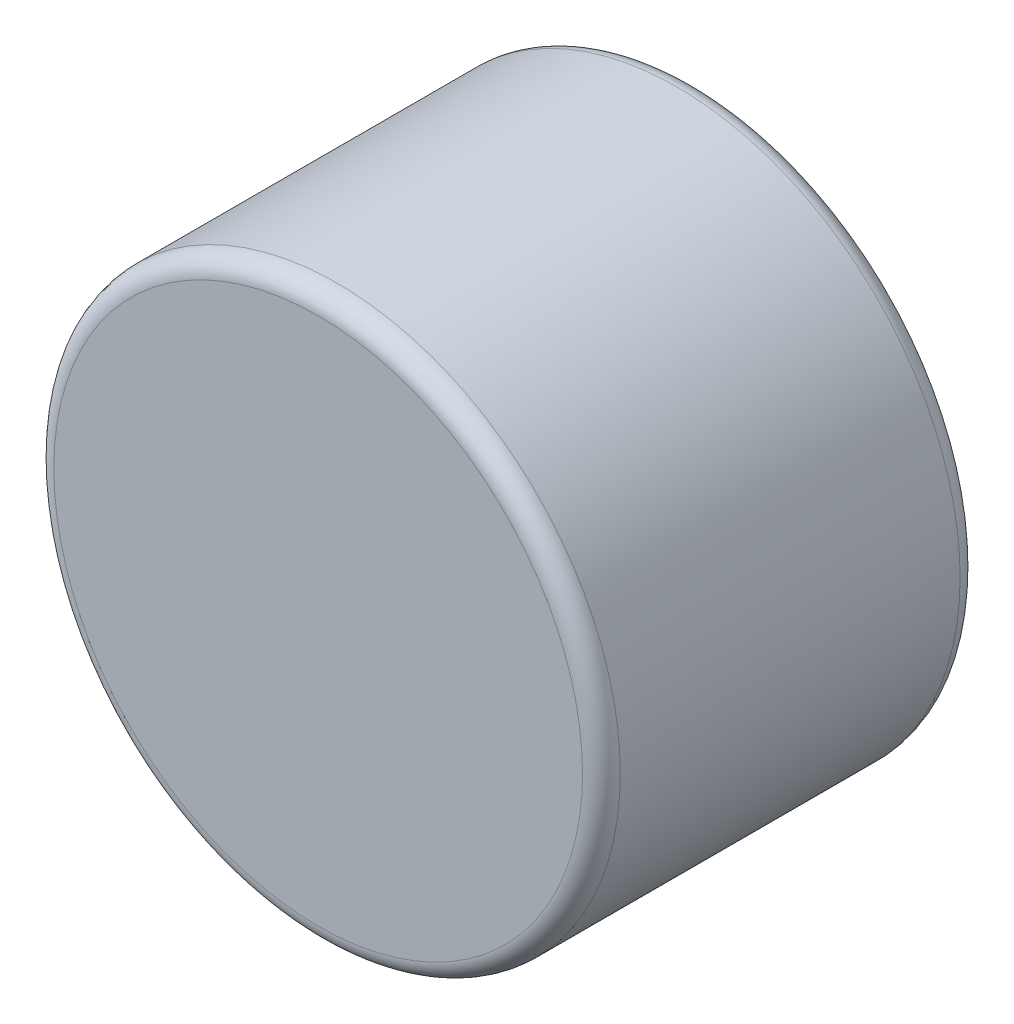
ISO-10303-21;
HEADER;
FILE_DESCRIPTION(('STEP AP214'),'2;1');
FILE_NAME('part.step','',(''),(''),'','','');
FILE_SCHEMA(('AUTOMOTIVE_DESIGN { 1 0 10303 214 1 1 1 1 }'));
ENDSEC;
DATA;
#1=APPLICATION_CONTEXT('core data for automotive mechanical design processes');
#2=APPLICATION_PROTOCOL_DEFINITION('international standard','automotive_design',2000,#1);
#3=PRODUCT_CONTEXT('',#1,'mechanical');
#4=PRODUCT('Part','Part','',(#3));
#5=PRODUCT_RELATED_PRODUCT_CATEGORY('part','',(#4));
#6=PRODUCT_DEFINITION_FORMATION('','',#4);
#7=PRODUCT_DEFINITION_CONTEXT('part definition',#1,'design');
#8=PRODUCT_DEFINITION('design','',#6,#7);
#9=PRODUCT_DEFINITION_SHAPE('','',#8);
#10=(LENGTH_UNIT() NAMED_UNIT(*) SI_UNIT(.MILLI.,.METRE.));
#11=(NAMED_UNIT(*) PLANE_ANGLE_UNIT() SI_UNIT($,.RADIAN.));
#12=(NAMED_UNIT(*) SI_UNIT($,.STERADIAN.) SOLID_ANGLE_UNIT());
#13=UNCERTAINTY_MEASURE_WITH_UNIT(LENGTH_MEASURE(1.E-05),#10,'distance_accuracy_value','');
#14=(GEOMETRIC_REPRESENTATION_CONTEXT(3) GLOBAL_UNCERTAINTY_ASSIGNED_CONTEXT((#13)) GLOBAL_UNIT_ASSIGNED_CONTEXT((#10,
#11,#12)) REPRESENTATION_CONTEXT('',''));
#15=CARTESIAN_POINT('',(0.,0.,0.));
#16=DIRECTION('',(0.,0.,1.));
#17=DIRECTION('',(1.,0.,0.));
#18=AXIS2_PLACEMENT_3D('',#15,#16,#17);
#19=CARTESIAN_POINT('',(0.,0.,4.));
#20=DIRECTION('',(0.,0.,-1.));
#21=DIRECTION('',(-1.,0.,0.));
#22=AXIS2_PLACEMENT_3D('',#19,#20,#21);
#23=CYLINDRICAL_SURFACE('',#22,3.);
#24=CARTESIAN_POINT('',(0.,0.,3.8));
#25=DIRECTION('',(0.,0.,1.));
#26=DIRECTION('',(1.,0.,0.));
#27=AXIS2_PLACEMENT_3D('',#24,#25,#26);
#28=CIRCLE('',#27,3.);
#29=CARTESIAN_POINT('',(3.,0.,3.8));
#30=VERTEX_POINT('',#29);
#31=EDGE_CURVE('E39',#30,#30,#28,.F.);
#32=ORIENTED_EDGE('',*,*,#31,.T.);
#33=EDGE_LOOP('',(#32));
#34=FACE_BOUND('',#33,.T.);
#35=CARTESIAN_POINT('',(0.,0.,0.2));
#36=DIRECTION('',(0.,0.,1.));
#37=DIRECTION('',(1.,0.,0.));
#38=AXIS2_PLACEMENT_3D('',#35,#36,#37);
#39=CIRCLE('',#38,3.);
#40=CARTESIAN_POINT('',(3.,0.,0.2));
#41=VERTEX_POINT('',#40);
#42=EDGE_CURVE('E43',#41,#41,#39,.T.);
#43=ORIENTED_EDGE('',*,*,#42,.T.);
#44=EDGE_LOOP('',(#43));
#45=FACE_BOUND('',#44,.T.);
#46=ADVANCED_FACE('F32',(#34,#45),#23,.T.);
#47=CARTESIAN_POINT('',(0.,0.,4.));
#48=DIRECTION('',(0.,0.,1.));
#49=DIRECTION('',(1.,0.,0.));
#50=AXIS2_PLACEMENT_3D('',#47,#48,#49);
#51=PLANE('',#50);
#52=CARTESIAN_POINT('',(0.,0.,4.));
#53=DIRECTION('',(0.,0.,1.));
#54=DIRECTION('',(1.,0.,0.));
#55=AXIS2_PLACEMENT_3D('',#52,#53,#54);
#56=CIRCLE('',#55,2.8);
#57=CARTESIAN_POINT('',(2.8,0.,4.));
#58=VERTEX_POINT('',#57);
#59=EDGE_CURVE('E47',#58,#58,#56,.T.);
#60=ORIENTED_EDGE('',*,*,#59,.T.);
#61=EDGE_LOOP('',(#60));
#62=FACE_BOUND('',#61,.T.);
#63=ADVANCED_FACE('F53',(#62),#51,.T.);
#64=CARTESIAN_POINT('',(0.,0.,0.));
#65=DIRECTION('',(0.,0.,1.));
#66=DIRECTION('',(1.,0.,0.));
#67=AXIS2_PLACEMENT_3D('',#64,#65,#66);
#68=PLANE('',#67);
#69=CARTESIAN_POINT('',(0.,0.,0.));
#70=DIRECTION('',(0.,0.,1.));
#71=DIRECTION('',(1.,0.,0.));
#72=AXIS2_PLACEMENT_3D('',#69,#70,#71);
#73=CIRCLE('',#72,2.8);
#74=CARTESIAN_POINT('',(2.8,0.,0.));
#75=VERTEX_POINT('',#74);
#76=EDGE_CURVE('E10',#75,#75,#73,.F.);
#77=ORIENTED_EDGE('',*,*,#76,.T.);
#78=EDGE_LOOP('',(#77));
#79=FACE_BOUND('',#78,.T.);
#80=ADVANCED_FACE('F57',(#79),#68,.F.);
#81=CARTESIAN_POINT('',(0.,0.,3.8));
#82=DIRECTION('',(0.,0.,1.));
#83=DIRECTION('',(1.,0.,0.));
#84=AXIS2_PLACEMENT_3D('',#81,#82,#83);
#85=TOROIDAL_SURFACE('',#84,2.8,0.2);
#86=ORIENTED_EDGE('',*,*,#31,.F.);
#87=EDGE_LOOP('',(#86));
#88=FACE_BOUND('',#87,.T.);
#89=ORIENTED_EDGE('',*,*,#59,.F.);
#90=EDGE_LOOP('',(#89));
#91=FACE_BOUND('',#90,.T.);
#92=ADVANCED_FACE('F55',(#88,#91),#85,.T.);
#93=CARTESIAN_POINT('',(0.,0.,0.2));
#94=DIRECTION('',(0.,0.,1.));
#95=DIRECTION('',(1.,0.,0.));
#96=AXIS2_PLACEMENT_3D('',#93,#94,#95);
#97=TOROIDAL_SURFACE('',#96,2.8,0.2);
#98=ORIENTED_EDGE('',*,*,#76,.F.);
#99=EDGE_LOOP('',(#98));
#100=FACE_BOUND('',#99,.T.);
#101=ORIENTED_EDGE('',*,*,#42,.F.);
#102=EDGE_LOOP('',(#101));
#103=FACE_BOUND('',#102,.T.);
#104=ADVANCED_FACE('F34',(#100,#103),#97,.T.);
#105=CLOSED_SHELL('',(#46,#63,#80,#92,#104));
#106=MANIFOLD_SOLID_BREP('B2',#105);
#107=ADVANCED_BREP_SHAPE_REPRESENTATION('',(#18,#106),#14);
#108=SHAPE_DEFINITION_REPRESENTATION(#9,#107);
ENDSEC;
END-ISO-10303-21;
